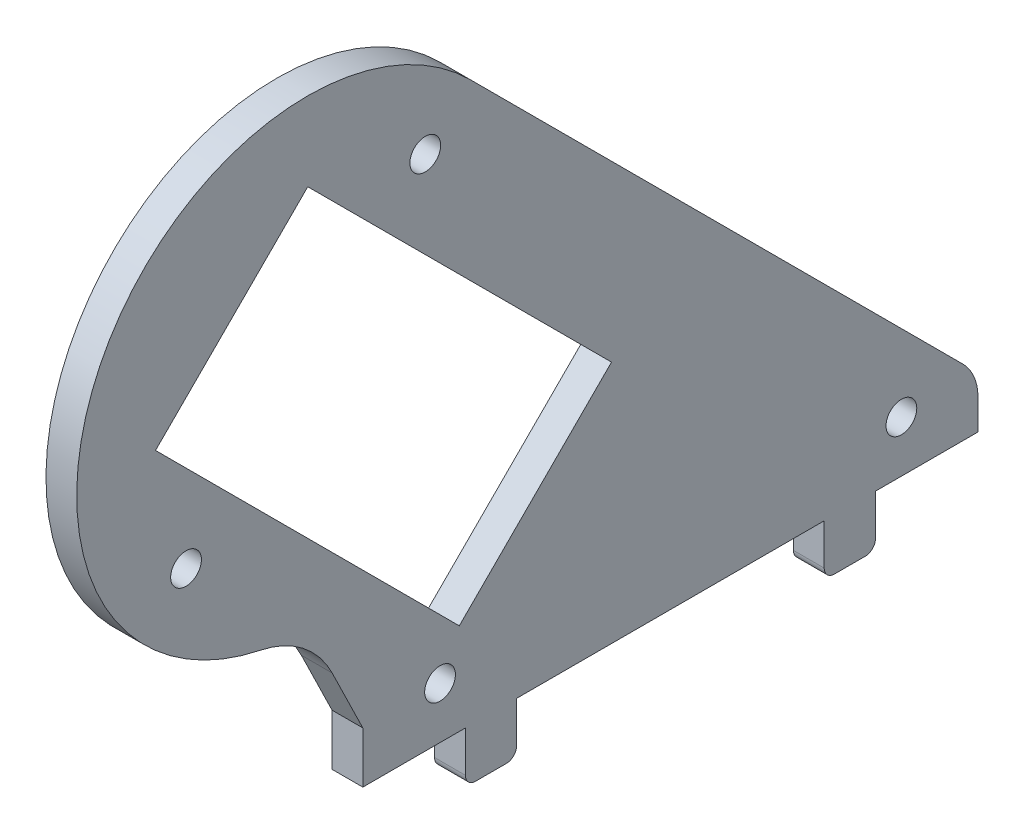
ISO-10303-21;
HEADER;
FILE_DESCRIPTION(('STEP AP214'),'2;1');
FILE_NAME('part.step','',(''),(''),'','','');
FILE_SCHEMA(('AUTOMOTIVE_DESIGN { 1 0 10303 214 1 1 1 1 }'));
ENDSEC;
DATA;
#1=APPLICATION_CONTEXT('core data for automotive mechanical design processes');
#2=APPLICATION_PROTOCOL_DEFINITION('international standard','automotive_design',2000,#1);
#3=PRODUCT_CONTEXT('',#1,'mechanical');
#4=PRODUCT('Part','Part','',(#3));
#5=PRODUCT_RELATED_PRODUCT_CATEGORY('part','',(#4));
#6=PRODUCT_DEFINITION_FORMATION('','',#4);
#7=PRODUCT_DEFINITION_CONTEXT('part definition',#1,'design');
#8=PRODUCT_DEFINITION('design','',#6,#7);
#9=PRODUCT_DEFINITION_SHAPE('','',#8);
#10=(LENGTH_UNIT() NAMED_UNIT(*) SI_UNIT(.MILLI.,.METRE.));
#11=(NAMED_UNIT(*) PLANE_ANGLE_UNIT() SI_UNIT($,.RADIAN.));
#12=(NAMED_UNIT(*) SI_UNIT($,.STERADIAN.) SOLID_ANGLE_UNIT());
#13=UNCERTAINTY_MEASURE_WITH_UNIT(LENGTH_MEASURE(1.E-05),#10,'distance_accuracy_value','');
#14=(GEOMETRIC_REPRESENTATION_CONTEXT(3) GLOBAL_UNCERTAINTY_ASSIGNED_CONTEXT((#13)) GLOBAL_UNIT_ASSIGNED_CONTEXT((#10,
#11,#12)) REPRESENTATION_CONTEXT('',''));
#15=CARTESIAN_POINT('',(0.,0.,0.));
#16=DIRECTION('',(0.,0.,1.));
#17=DIRECTION('',(1.,0.,0.));
#18=AXIS2_PLACEMENT_3D('',#15,#16,#17);
#19=CARTESIAN_POINT('',(3.,0.,0.));
#20=DIRECTION('',(1.,0.,0.));
#21=DIRECTION('',(0.,0.,-1.));
#22=AXIS2_PLACEMENT_3D('',#19,#20,#21);
#23=PLANE('',#22);
#24=CARTESIAN_POINT('',(3.,7.5,-22.5287166150444));
#25=DIRECTION('',(1.,0.,0.));
#26=DIRECTION('',(0.,0.,-1.));
#27=AXIS2_PLACEMENT_3D('',#24,#25,#26);
#28=CIRCLE('',#27,1.5);
#29=CARTESIAN_POINT('',(3.,7.5,-24.0287166150444));
#30=VERTEX_POINT('',#29);
#31=EDGE_CURVE('E729',#30,#30,#28,.T.);
#32=ORIENTED_EDGE('',*,*,#31,.F.);
#33=EDGE_LOOP('',(#32));
#34=FACE_BOUND('',#33,.T.);
#35=CARTESIAN_POINT('',(3.,52.9250962228143,23.9103775970528));
#36=DIRECTION('',(1.,0.,0.));
#37=DIRECTION('',(0.,0.,-1.));
#38=AXIS2_PLACEMENT_3D('',#35,#36,#37);
#39=CIRCLE('',#38,1.5);
#40=CARTESIAN_POINT('',(3.,52.9250962228143,22.4103775970528));
#41=VERTEX_POINT('',#40);
#42=EDGE_CURVE('E737',#41,#41,#39,.T.);
#43=ORIENTED_EDGE('',*,*,#42,.F.);
#44=EDGE_LOOP('',(#43));
#45=FACE_BOUND('',#44,.T.);
#46=CARTESIAN_POINT('',(3.,29.5905724436583,47.2449013762088));
#47=DIRECTION('',(1.,0.,0.));
#48=DIRECTION('',(0.,0.,-1.));
#49=AXIS2_PLACEMENT_3D('',#46,#47,#48);
#50=CIRCLE('',#49,1.5);
#51=CARTESIAN_POINT('',(3.,29.5905724436583,45.7449013762088));
#52=VERTEX_POINT('',#51);
#53=EDGE_CURVE('E733',#52,#52,#50,.T.);
#54=ORIENTED_EDGE('',*,*,#53,.F.);
#55=EDGE_LOOP('',(#54));
#56=FACE_BOUND('',#55,.T.);
#57=CARTESIAN_POINT('',(3.,7.5,22.4712833849556));
#58=DIRECTION('',(1.,0.,0.));
#59=DIRECTION('',(0.,0.,-1.));
#60=AXIS2_PLACEMENT_3D('',#57,#58,#59);
#61=CIRCLE('',#60,1.5);
#62=CARTESIAN_POINT('',(3.,7.5,20.9712833849556));
#63=VERTEX_POINT('',#62);
#64=EDGE_CURVE('E751',#63,#63,#61,.T.);
#65=ORIENTED_EDGE('',*,*,#64,.F.);
#66=EDGE_LOOP('',(#65));
#67=FACE_BOUND('',#66,.T.);
#68=DIRECTION('',(0.,-1.,0.));
#69=VECTOR('',#68,1.);
#70=CARTESIAN_POINT('',(3.,0.,-30.));
#71=LINE('',#70,#69);
#72=CARTESIAN_POINT('',(3.,5.42893218813453,-30.));
#73=VERTEX_POINT('',#72);
#74=CARTESIAN_POINT('',(3.,2.5,-30.));
#75=VERTEX_POINT('',#74);
#76=EDGE_CURVE('E275',#73,#75,#71,.T.);
#77=ORIENTED_EDGE('',*,*,#76,.F.);
#78=CARTESIAN_POINT('',(3.,5.42893218813453,-25.));
#79=DIRECTION('',(1.,0.,0.));
#80=DIRECTION('',(0.,0.,-1.));
#81=AXIS2_PLACEMENT_3D('',#78,#79,#80);
#82=CIRCLE('',#81,5.);
#83=CARTESIAN_POINT('',(3.,8.96446609406726,-28.5355339059327));
#84=VERTEX_POINT('',#83);
#85=EDGE_CURVE('E11',#73,#84,#82,.T.);
#86=ORIENTED_EDGE('',*,*,#85,.T.);
#87=DIRECTION('',(0.,0.707106781186549,0.707106781186546));
#88=VECTOR('',#87,1.);
#89=CARTESIAN_POINT('',(3.,18.75,-18.75));
#90=LINE('',#89,#88);
#91=CARTESIAN_POINT('',(3.,56.9974746830584,19.4974746830582));
#92=VERTEX_POINT('',#91);
#93=EDGE_CURVE('E240',#84,#92,#90,.T.);
#94=ORIENTED_EDGE('',*,*,#93,.T.);
#95=CARTESIAN_POINT('',(3.,41.0875721063611,35.4073772597556));
#96=DIRECTION('',(1.,0.,0.));
#97=DIRECTION('',(0.,0.,-1.));
#98=AXIS2_PLACEMENT_3D('',#95,#96,#97);
#99=CIRCLE('',#98,22.5);
#100=CARTESIAN_POINT('',(3.,19.0530880834944,39.9605644781809));
#101=VERTEX_POINT('',#100);
#102=EDGE_CURVE('E242',#92,#101,#99,.T.);
#103=ORIENTED_EDGE('',*,*,#102,.T.);
#104=CARTESIAN_POINT('',(3.,9.2599840733314,41.9842032419254));
#105=DIRECTION('',(1.,0.,0.));
#106=DIRECTION('',(0.,0.,-1.));
#107=AXIS2_PLACEMENT_3D('',#104,#105,#106);
#108=CIRCLE('',#107,10.);
#109=CARTESIAN_POINT('',(3.,13.6434381885261,32.9961372641979));
#110=VERTEX_POINT('',#109);
#111=EDGE_CURVE('E340',#101,#110,#108,.F.);
#112=ORIENTED_EDGE('',*,*,#111,.T.);
#113=DIRECTION('',(0.,-0.89880659777275,-0.43834541151947));
#114=VECTOR('',#113,1.);
#115=CARTESIAN_POINT('',(3.,-10.378532190812,21.2806908961665));
#116=LINE('',#115,#114);
#117=CARTESIAN_POINT('',(3.,7.5,30.));
#118=VERTEX_POINT('',#117);
#119=EDGE_CURVE('E246',#110,#118,#116,.T.);
#120=ORIENTED_EDGE('',*,*,#119,.T.);
#121=DIRECTION('',(0.,-1.,0.));
#122=VECTOR('',#121,1.);
#123=CARTESIAN_POINT('',(3.,0.,30.));
#124=LINE('',#123,#122);
#125=CARTESIAN_POINT('',(3.,2.5,30.));
#126=VERTEX_POINT('',#125);
#127=EDGE_CURVE('E248',#118,#126,#124,.T.);
#128=ORIENTED_EDGE('',*,*,#127,.T.);
#129=DIRECTION('',(0.,0.,1.));
#130=VECTOR('',#129,1.);
#131=CARTESIAN_POINT('',(3.,2.5,0.));
#132=LINE('',#131,#130);
#133=CARTESIAN_POINT('',(3.,2.5,20.));
#134=VERTEX_POINT('',#133);
#135=EDGE_CURVE('E250',#134,#126,#132,.T.);
#136=ORIENTED_EDGE('',*,*,#135,.F.);
#137=DIRECTION('',(0.,1.,0.));
#138=VECTOR('',#137,1.);
#139=CARTESIAN_POINT('',(3.,0.,20.));
#140=LINE('',#139,#138);
#141=CARTESIAN_POINT('',(3.,-1.5,20.));
#142=VERTEX_POINT('',#141);
#143=EDGE_CURVE('E253',#142,#134,#140,.T.);
#144=ORIENTED_EDGE('',*,*,#143,.F.);
#145=CARTESIAN_POINT('',(3.,-1.5,19.));
#146=DIRECTION('',(1.,0.,0.));
#147=DIRECTION('',(0.,0.,-1.));
#148=AXIS2_PLACEMENT_3D('',#145,#146,#147);
#149=CIRCLE('',#148,1.);
#150=CARTESIAN_POINT('',(3.,-2.5,19.));
#151=VERTEX_POINT('',#150);
#152=EDGE_CURVE('E363',#142,#151,#149,.T.);
#153=ORIENTED_EDGE('',*,*,#152,.T.);
#154=DIRECTION('',(0.,0.,1.));
#155=VECTOR('',#154,1.);
#156=CARTESIAN_POINT('',(3.,-2.5,0.));
#157=LINE('',#156,#155);
#158=CARTESIAN_POINT('',(3.,-2.5,16.));
#159=VERTEX_POINT('',#158);
#160=EDGE_CURVE('E255',#159,#151,#157,.T.);
#161=ORIENTED_EDGE('',*,*,#160,.F.);
#162=CARTESIAN_POINT('',(3.,-1.5,16.));
#163=DIRECTION('',(1.,0.,0.));
#164=DIRECTION('',(0.,0.,-1.));
#165=AXIS2_PLACEMENT_3D('',#162,#163,#164);
#166=CIRCLE('',#165,1.);
#167=CARTESIAN_POINT('',(3.,-1.5,15.));
#168=VERTEX_POINT('',#167);
#169=EDGE_CURVE('E361',#159,#168,#166,.T.);
#170=ORIENTED_EDGE('',*,*,#169,.T.);
#171=DIRECTION('',(0.,-1.,0.));
#172=VECTOR('',#171,1.);
#173=CARTESIAN_POINT('',(3.,0.,15.));
#174=LINE('',#173,#172);
#175=CARTESIAN_POINT('',(3.,2.5,15.));
#176=VERTEX_POINT('',#175);
#177=EDGE_CURVE('E258',#176,#168,#174,.T.);
#178=ORIENTED_EDGE('',*,*,#177,.F.);
#179=DIRECTION('',(0.,0.,1.));
#180=VECTOR('',#179,1.);
#181=CARTESIAN_POINT('',(3.,2.49999999999999,0.));
#182=LINE('',#181,#180);
#183=CARTESIAN_POINT('',(3.,2.49999999999998,-15.));
#184=VERTEX_POINT('',#183);
#185=EDGE_CURVE('E261',#184,#176,#182,.T.);
#186=ORIENTED_EDGE('',*,*,#185,.F.);
#187=DIRECTION('',(0.,-1.,0.));
#188=VECTOR('',#187,1.);
#189=CARTESIAN_POINT('',(3.,0.,-15.));
#190=LINE('',#189,#188);
#191=CARTESIAN_POINT('',(3.,-1.5,-15.));
#192=VERTEX_POINT('',#191);
#193=EDGE_CURVE('E264',#184,#192,#190,.T.);
#194=ORIENTED_EDGE('',*,*,#193,.T.);
#195=CARTESIAN_POINT('',(3.,-1.5,-16.));
#196=DIRECTION('',(1.,0.,0.));
#197=DIRECTION('',(0.,0.,-1.));
#198=AXIS2_PLACEMENT_3D('',#195,#196,#197);
#199=CIRCLE('',#198,1.);
#200=CARTESIAN_POINT('',(3.,-2.5,-16.));
#201=VERTEX_POINT('',#200);
#202=EDGE_CURVE('E359',#192,#201,#199,.T.);
#203=ORIENTED_EDGE('',*,*,#202,.T.);
#204=DIRECTION('',(0.,0.,1.));
#205=VECTOR('',#204,1.);
#206=CARTESIAN_POINT('',(3.,-2.5,0.));
#207=LINE('',#206,#205);
#208=CARTESIAN_POINT('',(3.,-2.5,-19.));
#209=VERTEX_POINT('',#208);
#210=EDGE_CURVE('E267',#209,#201,#207,.T.);
#211=ORIENTED_EDGE('',*,*,#210,.F.);
#212=CARTESIAN_POINT('',(3.,-1.5,-19.));
#213=DIRECTION('',(1.,0.,0.));
#214=DIRECTION('',(0.,0.,-1.));
#215=AXIS2_PLACEMENT_3D('',#212,#213,#214);
#216=CIRCLE('',#215,1.);
#217=CARTESIAN_POINT('',(3.,-1.5,-20.));
#218=VERTEX_POINT('',#217);
#219=EDGE_CURVE('E357',#209,#218,#216,.T.);
#220=ORIENTED_EDGE('',*,*,#219,.T.);
#221=DIRECTION('',(0.,1.,0.));
#222=VECTOR('',#221,1.);
#223=CARTESIAN_POINT('',(3.,0.,-20.));
#224=LINE('',#223,#222);
#225=CARTESIAN_POINT('',(3.,2.5,-20.));
#226=VERTEX_POINT('',#225);
#227=EDGE_CURVE('E270',#218,#226,#224,.T.);
#228=ORIENTED_EDGE('',*,*,#227,.T.);
#229=DIRECTION('',(0.,0.,1.));
#230=VECTOR('',#229,1.);
#231=CARTESIAN_POINT('',(3.,2.5,0.));
#232=LINE('',#231,#230);
#233=EDGE_CURVE('E272',#75,#226,#232,.T.);
#234=ORIENTED_EDGE('',*,*,#233,.F.);
#235=EDGE_LOOP('',(#77,#86,#94,#103,#112,#120,#128,#136,#144,#153,#161,#170,#178,#186,#194,#203,
#211,#220,#228,#234));
#236=FACE_BOUND('',#235,.T.);
#237=DIRECTION('',(0.,0.707106781186547,0.707106781186548));
#238=VECTOR('',#237,1.);
#239=CARTESIAN_POINT('',(3.,-4.58452377915599,4.58452377915599));
#240=LINE('',#239,#238);
#241=CARTESIAN_POINT('',(3.,11.4244426355855,20.5934901938974));
#242=VERTEX_POINT('',#241);
#243=CARTESIAN_POINT('',(3.,41.0522167673018,50.2212643256138));
#244=VERTEX_POINT('',#243);
#245=EDGE_CURVE('E233',#242,#244,#240,.T.);
#246=ORIENTED_EDGE('',*,*,#245,.T.);
#247=DIRECTION('',(0.,0.707106781186548,-0.707106781186548));
#248=VECTOR('',#247,1.);
#249=CARTESIAN_POINT('',(3.,45.6367405464578,45.6367405464578));
#250=LINE('',#249,#248);
#251=CARTESIAN_POINT('',(3.,55.9014591722193,35.3720219206963));
#252=VERTEX_POINT('',#251);
#253=EDGE_CURVE('E236',#244,#252,#250,.T.);
#254=ORIENTED_EDGE('',*,*,#253,.T.);
#255=DIRECTION('',(0.,-0.707106781186548,-0.707106781186548));
#256=VECTOR('',#255,1.);
#257=CARTESIAN_POINT('',(3.,10.2647186257615,-10.2647186257615));
#258=LINE('',#257,#256);
#259=CARTESIAN_POINT('',(3.,26.2736850405029,5.74424778897995));
#260=VERTEX_POINT('',#259);
#261=EDGE_CURVE('E228',#252,#260,#258,.T.);
#262=ORIENTED_EDGE('',*,*,#261,.T.);
#263=DIRECTION('',(0.,0.707106781186547,-0.707106781186548));
#264=VECTOR('',#263,1.);
#265=CARTESIAN_POINT('',(3.,16.0089664147415,16.0089664147414));
#266=LINE('',#265,#264);
#267=EDGE_CURVE('E204',#242,#260,#266,.T.);
#268=ORIENTED_EDGE('',*,*,#267,.F.);
#269=EDGE_LOOP('',(#246,#254,#262,#268));
#270=FACE_BOUND('',#269,.T.);
#271=ADVANCED_FACE('F37',(#34,#45,#56,#67,#236,#270),#23,.T.);
#272=CARTESIAN_POINT('',(0.,0.,0.));
#273=DIRECTION('',(1.,0.,0.));
#274=DIRECTION('',(0.,0.,-1.));
#275=AXIS2_PLACEMENT_3D('',#272,#273,#274);
#276=PLANE('',#275);
#277=CARTESIAN_POINT('',(0.,7.5,-22.5287166150444));
#278=DIRECTION('',(-1.,0.,0.));
#279=DIRECTION('',(0.,0.,1.));
#280=AXIS2_PLACEMENT_3D('',#277,#278,#279);
#281=CIRCLE('',#280,1.5);
#282=CARTESIAN_POINT('',(0.,7.5,-21.0287166150444));
#283=VERTEX_POINT('',#282);
#284=EDGE_CURVE('E732',#283,#283,#281,.T.);
#285=ORIENTED_EDGE('',*,*,#284,.F.);
#286=EDGE_LOOP('',(#285));
#287=FACE_BOUND('',#286,.T.);
#288=CARTESIAN_POINT('',(0.,52.9250962228143,23.9103775970528));
#289=DIRECTION('',(-1.,0.,0.));
#290=DIRECTION('',(0.,0.,1.));
#291=AXIS2_PLACEMENT_3D('',#288,#289,#290);
#292=CIRCLE('',#291,1.5);
#293=CARTESIAN_POINT('',(0.,52.9250962228143,25.4103775970528));
#294=VERTEX_POINT('',#293);
#295=EDGE_CURVE('E734',#294,#294,#292,.T.);
#296=ORIENTED_EDGE('',*,*,#295,.F.);
#297=EDGE_LOOP('',(#296));
#298=FACE_BOUND('',#297,.T.);
#299=CARTESIAN_POINT('',(0.,29.5905724436583,47.2449013762088));
#300=DIRECTION('',(-1.,0.,0.));
#301=DIRECTION('',(0.,0.,1.));
#302=AXIS2_PLACEMENT_3D('',#299,#300,#301);
#303=CIRCLE('',#302,1.5);
#304=CARTESIAN_POINT('',(0.,29.5905724436583,48.7449013762088));
#305=VERTEX_POINT('',#304);
#306=EDGE_CURVE('E740',#305,#305,#303,.T.);
#307=ORIENTED_EDGE('',*,*,#306,.F.);
#308=EDGE_LOOP('',(#307));
#309=FACE_BOUND('',#308,.T.);
#310=CARTESIAN_POINT('',(0.,7.5,22.4712833849556));
#311=DIRECTION('',(-1.,0.,0.));
#312=DIRECTION('',(0.,0.,1.));
#313=AXIS2_PLACEMENT_3D('',#310,#311,#312);
#314=CIRCLE('',#313,1.5);
#315=CARTESIAN_POINT('',(0.,7.5,23.9712833849556));
#316=VERTEX_POINT('',#315);
#317=EDGE_CURVE('E748',#316,#316,#314,.T.);
#318=ORIENTED_EDGE('',*,*,#317,.F.);
#319=EDGE_LOOP('',(#318));
#320=FACE_BOUND('',#319,.T.);
#321=DIRECTION('',(0.,0.707106781186549,0.707106781186546));
#322=VECTOR('',#321,1.);
#323=CARTESIAN_POINT('',(0.,18.75,-18.75));
#324=LINE('',#323,#322);
#325=CARTESIAN_POINT('',(0.,8.96446609406726,-28.5355339059327));
#326=VERTEX_POINT('',#325);
#327=CARTESIAN_POINT('',(0.,56.9974746830584,19.4974746830582));
#328=VERTEX_POINT('',#327);
#329=EDGE_CURVE('E239',#326,#328,#324,.T.);
#330=ORIENTED_EDGE('',*,*,#329,.F.);
#331=CARTESIAN_POINT('',(0.,5.42893218813453,-25.));
#332=DIRECTION('',(1.,0.,0.));
#333=DIRECTION('',(0.,0.,-1.));
#334=AXIS2_PLACEMENT_3D('',#331,#332,#333);
#335=CIRCLE('',#334,5.);
#336=CARTESIAN_POINT('',(0.,5.42893218813453,-30.));
#337=VERTEX_POINT('',#336);
#338=EDGE_CURVE('E59',#326,#337,#335,.F.);
#339=ORIENTED_EDGE('',*,*,#338,.T.);
#340=DIRECTION('',(0.,-1.,0.));
#341=VECTOR('',#340,1.);
#342=CARTESIAN_POINT('',(0.,0.,-30.));
#343=LINE('',#342,#341);
#344=CARTESIAN_POINT('',(0.,2.5,-30.));
#345=VERTEX_POINT('',#344);
#346=EDGE_CURVE('E243',#337,#345,#343,.T.);
#347=ORIENTED_EDGE('',*,*,#346,.T.);
#348=DIRECTION('',(0.,0.,1.));
#349=VECTOR('',#348,1.);
#350=CARTESIAN_POINT('',(0.,2.5,0.));
#351=LINE('',#350,#349);
#352=CARTESIAN_POINT('',(0.,2.5,-20.));
#353=VERTEX_POINT('',#352);
#354=EDGE_CURVE('E309',#345,#353,#351,.T.);
#355=ORIENTED_EDGE('',*,*,#354,.T.);
#356=DIRECTION('',(0.,1.,0.));
#357=VECTOR('',#356,1.);
#358=CARTESIAN_POINT('',(0.,0.,-20.));
#359=LINE('',#358,#357);
#360=CARTESIAN_POINT('',(0.,-1.5,-20.));
#361=VERTEX_POINT('',#360);
#362=EDGE_CURVE('E307',#361,#353,#359,.T.);
#363=ORIENTED_EDGE('',*,*,#362,.F.);
#364=CARTESIAN_POINT('',(0.,-1.5,-19.));
#365=DIRECTION('',(1.,0.,0.));
#366=DIRECTION('',(0.,0.,-1.));
#367=AXIS2_PLACEMENT_3D('',#364,#365,#366);
#368=CIRCLE('',#367,1.);
#369=CARTESIAN_POINT('',(0.,-2.5,-19.));
#370=VERTEX_POINT('',#369);
#371=EDGE_CURVE('E347',#361,#370,#368,.F.);
#372=ORIENTED_EDGE('',*,*,#371,.T.);
#373=DIRECTION('',(0.,0.,1.));
#374=VECTOR('',#373,1.);
#375=CARTESIAN_POINT('',(0.,-2.5,0.));
#376=LINE('',#375,#374);
#377=CARTESIAN_POINT('',(0.,-2.5,-16.));
#378=VERTEX_POINT('',#377);
#379=EDGE_CURVE('E304',#370,#378,#376,.T.);
#380=ORIENTED_EDGE('',*,*,#379,.T.);
#381=CARTESIAN_POINT('',(0.,-1.5,-16.));
#382=DIRECTION('',(1.,0.,0.));
#383=DIRECTION('',(0.,0.,-1.));
#384=AXIS2_PLACEMENT_3D('',#381,#382,#383);
#385=CIRCLE('',#384,1.);
#386=CARTESIAN_POINT('',(0.,-1.5,-15.));
#387=VERTEX_POINT('',#386);
#388=EDGE_CURVE('E349',#378,#387,#385,.F.);
#389=ORIENTED_EDGE('',*,*,#388,.T.);
#390=DIRECTION('',(0.,-1.,0.));
#391=VECTOR('',#390,1.);
#392=CARTESIAN_POINT('',(0.,0.,-15.));
#393=LINE('',#392,#391);
#394=CARTESIAN_POINT('',(0.,2.49999999999998,-15.));
#395=VERTEX_POINT('',#394);
#396=EDGE_CURVE('E301',#395,#387,#393,.T.);
#397=ORIENTED_EDGE('',*,*,#396,.F.);
#398=DIRECTION('',(0.,0.,1.));
#399=VECTOR('',#398,1.);
#400=CARTESIAN_POINT('',(0.,2.49999999999999,0.));
#401=LINE('',#400,#399);
#402=CARTESIAN_POINT('',(0.,2.5,15.));
#403=VERTEX_POINT('',#402);
#404=EDGE_CURVE('E298',#395,#403,#401,.T.);
#405=ORIENTED_EDGE('',*,*,#404,.T.);
#406=DIRECTION('',(0.,-1.,0.));
#407=VECTOR('',#406,1.);
#408=CARTESIAN_POINT('',(0.,0.,15.));
#409=LINE('',#408,#407);
#410=CARTESIAN_POINT('',(0.,-1.5,15.));
#411=VERTEX_POINT('',#410);
#412=EDGE_CURVE('E295',#403,#411,#409,.T.);
#413=ORIENTED_EDGE('',*,*,#412,.T.);
#414=CARTESIAN_POINT('',(0.,-1.5,16.));
#415=DIRECTION('',(1.,0.,0.));
#416=DIRECTION('',(0.,0.,-1.));
#417=AXIS2_PLACEMENT_3D('',#414,#415,#416);
#418=CIRCLE('',#417,1.);
#419=CARTESIAN_POINT('',(0.,-2.5,16.));
#420=VERTEX_POINT('',#419);
#421=EDGE_CURVE('E351',#411,#420,#418,.F.);
#422=ORIENTED_EDGE('',*,*,#421,.T.);
#423=DIRECTION('',(0.,0.,1.));
#424=VECTOR('',#423,1.);
#425=CARTESIAN_POINT('',(0.,-2.5,0.));
#426=LINE('',#425,#424);
#427=CARTESIAN_POINT('',(0.,-2.5,19.));
#428=VERTEX_POINT('',#427);
#429=EDGE_CURVE('E292',#420,#428,#426,.T.);
#430=ORIENTED_EDGE('',*,*,#429,.T.);
#431=CARTESIAN_POINT('',(0.,-1.5,19.));
#432=DIRECTION('',(1.,0.,0.));
#433=DIRECTION('',(0.,0.,-1.));
#434=AXIS2_PLACEMENT_3D('',#431,#432,#433);
#435=CIRCLE('',#434,1.);
#436=CARTESIAN_POINT('',(0.,-1.5,20.));
#437=VERTEX_POINT('',#436);
#438=EDGE_CURVE('E353',#428,#437,#435,.F.);
#439=ORIENTED_EDGE('',*,*,#438,.T.);
#440=DIRECTION('',(0.,1.,0.));
#441=VECTOR('',#440,1.);
#442=CARTESIAN_POINT('',(0.,0.,20.));
#443=LINE('',#442,#441);
#444=CARTESIAN_POINT('',(0.,2.5,20.));
#445=VERTEX_POINT('',#444);
#446=EDGE_CURVE('E290',#437,#445,#443,.T.);
#447=ORIENTED_EDGE('',*,*,#446,.T.);
#448=DIRECTION('',(0.,0.,1.));
#449=VECTOR('',#448,1.);
#450=CARTESIAN_POINT('',(0.,2.5,0.));
#451=LINE('',#450,#449);
#452=CARTESIAN_POINT('',(0.,2.5,30.));
#453=VERTEX_POINT('',#452);
#454=EDGE_CURVE('E287',#445,#453,#451,.T.);
#455=ORIENTED_EDGE('',*,*,#454,.T.);
#456=DIRECTION('',(0.,-1.,0.));
#457=VECTOR('',#456,1.);
#458=CARTESIAN_POINT('',(0.,0.,30.));
#459=LINE('',#458,#457);
#460=CARTESIAN_POINT('',(0.,7.5,30.));
#461=VERTEX_POINT('',#460);
#462=EDGE_CURVE('E284',#461,#453,#459,.T.);
#463=ORIENTED_EDGE('',*,*,#462,.F.);
#464=DIRECTION('',(0.,-0.89880659777275,-0.43834541151947));
#465=VECTOR('',#464,1.);
#466=CARTESIAN_POINT('',(0.,-10.378532190812,21.2806908961665));
#467=LINE('',#466,#465);
#468=CARTESIAN_POINT('',(0.,13.6434381885261,32.9961372641979));
#469=VERTEX_POINT('',#468);
#470=EDGE_CURVE('E282',#469,#461,#467,.T.);
#471=ORIENTED_EDGE('',*,*,#470,.F.);
#472=CARTESIAN_POINT('',(0.,9.2599840733314,41.9842032419254));
#473=DIRECTION('',(1.,0.,0.));
#474=DIRECTION('',(0.,0.,-1.));
#475=AXIS2_PLACEMENT_3D('',#472,#473,#474);
#476=CIRCLE('',#475,10.);
#477=CARTESIAN_POINT('',(0.,19.0530880834944,39.9605644781809));
#478=VERTEX_POINT('',#477);
#479=EDGE_CURVE('E338',#469,#478,#476,.T.);
#480=ORIENTED_EDGE('',*,*,#479,.T.);
#481=CARTESIAN_POINT('',(0.,41.0875721063611,35.4073772597556));
#482=DIRECTION('',(1.,0.,0.));
#483=DIRECTION('',(0.,0.,-1.));
#484=AXIS2_PLACEMENT_3D('',#481,#482,#483);
#485=CIRCLE('',#484,22.5);
#486=EDGE_CURVE('E279',#328,#478,#485,.T.);
#487=ORIENTED_EDGE('',*,*,#486,.F.);
#488=EDGE_LOOP('',(#330,#339,#347,#355,#363,#372,#380,#389,#397,#405,#413,#422,#430,#439,#447,
#455,#463,#471,#480,#487));
#489=FACE_BOUND('',#488,.T.);
#490=DIRECTION('',(0.,-0.707106781186548,0.707106781186548));
#491=VECTOR('',#490,1.);
#492=CARTESIAN_POINT('',(0.,45.6367405464578,45.6367405464578));
#493=LINE('',#492,#491);
#494=CARTESIAN_POINT('',(0.,55.9014591722193,35.3720219206963));
#495=VERTEX_POINT('',#494);
#496=CARTESIAN_POINT('',(0.,41.0522167673018,50.2212643256138));
#497=VERTEX_POINT('',#496);
#498=EDGE_CURVE('E217',#495,#497,#493,.T.);
#499=ORIENTED_EDGE('',*,*,#498,.T.);
#500=DIRECTION('',(0.,-0.707106781186547,-0.707106781186548));
#501=VECTOR('',#500,1.);
#502=CARTESIAN_POINT('',(0.,-4.58452377915599,4.58452377915599));
#503=LINE('',#502,#501);
#504=CARTESIAN_POINT('',(0.,11.4244426355855,20.5934901938974));
#505=VERTEX_POINT('',#504);
#506=EDGE_CURVE('E221',#497,#505,#503,.T.);
#507=ORIENTED_EDGE('',*,*,#506,.T.);
#508=DIRECTION('',(0.,-0.707106781186547,0.707106781186548));
#509=VECTOR('',#508,1.);
#510=CARTESIAN_POINT('',(0.,16.0089664147415,16.0089664147414));
#511=LINE('',#510,#509);
#512=CARTESIAN_POINT('',(0.,26.2736850405029,5.74424778897995));
#513=VERTEX_POINT('',#512);
#514=EDGE_CURVE('E201',#513,#505,#511,.T.);
#515=ORIENTED_EDGE('',*,*,#514,.F.);
#516=DIRECTION('',(0.,0.707106781186548,0.707106781186548));
#517=VECTOR('',#516,1.);
#518=CARTESIAN_POINT('',(0.,10.2647186257615,-10.2647186257615));
#519=LINE('',#518,#517);
#520=EDGE_CURVE('E212',#513,#495,#519,.T.);
#521=ORIENTED_EDGE('',*,*,#520,.T.);
#522=EDGE_LOOP('',(#499,#507,#515,#521));
#523=FACE_BOUND('',#522,.T.);
#524=ADVANCED_FACE('F219',(#287,#298,#309,#320,#489,#523),#276,.F.);
#525=CARTESIAN_POINT('',(3.,18.75,-18.75));
#526=DIRECTION('',(0.,-0.707106781186546,0.707106781186548));
#527=DIRECTION('',(0.,-0.707106781186549,-0.707106781186546));
#528=AXIS2_PLACEMENT_3D('',#525,#526,#527);
#529=PLANE('',#528);
#530=ORIENTED_EDGE('',*,*,#93,.F.);
#531=DIRECTION('',(-1.,0.,0.));
#532=VECTOR('',#531,1.);
#533=CARTESIAN_POINT('',(0.,8.96446609406726,-28.5355339059327));
#534=LINE('',#533,#532);
#535=EDGE_CURVE('E378',#84,#326,#534,.T.);
#536=ORIENTED_EDGE('',*,*,#535,.T.);
#537=ORIENTED_EDGE('',*,*,#329,.T.);
#538=DIRECTION('',(-1.,0.,0.));
#539=VECTOR('',#538,1.);
#540=CARTESIAN_POINT('',(3.,56.9974746830584,19.4974746830582));
#541=LINE('',#540,#539);
#542=EDGE_CURVE('E330',#92,#328,#541,.T.);
#543=ORIENTED_EDGE('',*,*,#542,.F.);
#544=EDGE_LOOP('',(#530,#536,#537,#543));
#545=FACE_BOUND('',#544,.T.);
#546=ADVANCED_FACE('F384',(#545),#529,.F.);
#547=CARTESIAN_POINT('',(3.,41.0875721063611,35.4073772597556));
#548=DIRECTION('',(-1.,0.,0.));
#549=DIRECTION('',(0.,0.,1.));
#550=AXIS2_PLACEMENT_3D('',#547,#548,#549);
#551=CYLINDRICAL_SURFACE('',#550,22.5);
#552=ORIENTED_EDGE('',*,*,#486,.T.);
#553=DIRECTION('',(-1.,0.,0.));
#554=VECTOR('',#553,1.);
#555=CARTESIAN_POINT('',(3.,19.0530880834944,39.9605644781809));
#556=LINE('',#555,#554);
#557=EDGE_CURVE('E336',#478,#101,#556,.F.);
#558=ORIENTED_EDGE('',*,*,#557,.T.);
#559=ORIENTED_EDGE('',*,*,#102,.F.);
#560=ORIENTED_EDGE('',*,*,#542,.T.);
#561=EDGE_LOOP('',(#552,#558,#559,#560));
#562=FACE_BOUND('',#561,.T.);
#563=ADVANCED_FACE('F393',(#562),#551,.T.);
#564=CARTESIAN_POINT('',(3.,-10.378532190812,21.2806908961665));
#565=DIRECTION('',(0.,0.43834541151947,-0.898806597772751));
#566=DIRECTION('',(0.,0.898806597772751,0.43834541151947));
#567=AXIS2_PLACEMENT_3D('',#564,#565,#566);
#568=PLANE('',#567);
#569=ORIENTED_EDGE('',*,*,#119,.F.);
#570=DIRECTION('',(1.,0.,0.));
#571=VECTOR('',#570,1.);
#572=CARTESIAN_POINT('',(0.,13.6434381885261,32.9961372641979));
#573=LINE('',#572,#571);
#574=EDGE_CURVE('E333',#110,#469,#573,.F.);
#575=ORIENTED_EDGE('',*,*,#574,.T.);
#576=ORIENTED_EDGE('',*,*,#470,.T.);
#577=DIRECTION('',(-1.,0.,0.));
#578=VECTOR('',#577,1.);
#579=CARTESIAN_POINT('',(3.,7.5,30.));
#580=LINE('',#579,#578);
#581=EDGE_CURVE('E327',#118,#461,#580,.T.);
#582=ORIENTED_EDGE('',*,*,#581,.F.);
#583=EDGE_LOOP('',(#569,#575,#576,#582));
#584=FACE_BOUND('',#583,.T.);
#585=ADVANCED_FACE('F402',(#584),#568,.F.);
#586=CARTESIAN_POINT('',(3.,0.,30.));
#587=DIRECTION('',(0.,0.,-1.));
#588=DIRECTION('',(0.,1.,0.));
#589=AXIS2_PLACEMENT_3D('',#586,#587,#588);
#590=PLANE('',#589);
#591=ORIENTED_EDGE('',*,*,#462,.T.);
#592=DIRECTION('',(-1.,0.,0.));
#593=VECTOR('',#592,1.);
#594=CARTESIAN_POINT('',(3.,2.5,30.));
#595=LINE('',#594,#593);
#596=EDGE_CURVE('E325',#126,#453,#595,.T.);
#597=ORIENTED_EDGE('',*,*,#596,.F.);
#598=ORIENTED_EDGE('',*,*,#127,.F.);
#599=ORIENTED_EDGE('',*,*,#581,.T.);
#600=EDGE_LOOP('',(#591,#597,#598,#599));
#601=FACE_BOUND('',#600,.T.);
#602=ADVANCED_FACE('F408',(#601),#590,.F.);
#603=CARTESIAN_POINT('',(3.,2.5,0.));
#604=DIRECTION('',(0.,-1.,0.));
#605=DIRECTION('',(0.,0.,-1.));
#606=AXIS2_PLACEMENT_3D('',#603,#604,#605);
#607=PLANE('',#606);
#608=ORIENTED_EDGE('',*,*,#454,.F.);
#609=DIRECTION('',(-1.,0.,0.));
#610=VECTOR('',#609,1.);
#611=CARTESIAN_POINT('',(3.,2.5,20.));
#612=LINE('',#611,#610);
#613=EDGE_CURVE('E322',#134,#445,#612,.T.);
#614=ORIENTED_EDGE('',*,*,#613,.F.);
#615=ORIENTED_EDGE('',*,*,#135,.T.);
#616=ORIENTED_EDGE('',*,*,#596,.T.);
#617=EDGE_LOOP('',(#608,#614,#615,#616));
#618=FACE_BOUND('',#617,.T.);
#619=ADVANCED_FACE('F415',(#618),#607,.T.);
#620=CARTESIAN_POINT('',(3.,0.,20.));
#621=DIRECTION('',(0.,0.,1.));
#622=DIRECTION('',(1.,0.,0.));
#623=AXIS2_PLACEMENT_3D('',#620,#621,#622);
#624=PLANE('',#623);
#625=ORIENTED_EDGE('',*,*,#446,.F.);
#626=DIRECTION('',(-1.,0.,0.));
#627=VECTOR('',#626,1.);
#628=CARTESIAN_POINT('',(3.,-1.5,20.));
#629=LINE('',#628,#627);
#630=EDGE_CURVE('E355',#437,#142,#629,.F.);
#631=ORIENTED_EDGE('',*,*,#630,.T.);
#632=ORIENTED_EDGE('',*,*,#143,.T.);
#633=ORIENTED_EDGE('',*,*,#613,.T.);
#634=EDGE_LOOP('',(#625,#631,#632,#633));
#635=FACE_BOUND('',#634,.T.);
#636=ADVANCED_FACE('F418',(#635),#624,.T.);
#637=CARTESIAN_POINT('',(3.,-2.5,0.));
#638=DIRECTION('',(0.,-1.,0.));
#639=DIRECTION('',(0.,0.,-1.));
#640=AXIS2_PLACEMENT_3D('',#637,#638,#639);
#641=PLANE('',#640);
#642=ORIENTED_EDGE('',*,*,#160,.T.);
#643=DIRECTION('',(-1.,0.,0.));
#644=VECTOR('',#643,1.);
#645=CARTESIAN_POINT('',(3.,-2.5,19.));
#646=LINE('',#645,#644);
#647=EDGE_CURVE('E344',#151,#428,#646,.T.);
#648=ORIENTED_EDGE('',*,*,#647,.T.);
#649=ORIENTED_EDGE('',*,*,#429,.F.);
#650=DIRECTION('',(-1.,0.,0.));
#651=VECTOR('',#650,1.);
#652=CARTESIAN_POINT('',(3.,-2.5,16.));
#653=LINE('',#652,#651);
#654=EDGE_CURVE('E342',#420,#159,#653,.F.);
#655=ORIENTED_EDGE('',*,*,#654,.T.);
#656=EDGE_LOOP('',(#642,#648,#649,#655));
#657=FACE_BOUND('',#656,.T.);
#658=ADVANCED_FACE('F426',(#657),#641,.T.);
#659=CARTESIAN_POINT('',(3.,0.,15.));
#660=DIRECTION('',(0.,0.,-1.));
#661=DIRECTION('',(-1.,0.,0.));
#662=AXIS2_PLACEMENT_3D('',#659,#660,#661);
#663=PLANE('',#662);
#664=ORIENTED_EDGE('',*,*,#177,.T.);
#665=DIRECTION('',(-1.,0.,0.));
#666=VECTOR('',#665,1.);
#667=CARTESIAN_POINT('',(3.,-1.5,15.));
#668=LINE('',#667,#666);
#669=EDGE_CURVE('E365',#168,#411,#668,.T.);
#670=ORIENTED_EDGE('',*,*,#669,.T.);
#671=ORIENTED_EDGE('',*,*,#412,.F.);
#672=DIRECTION('',(-1.,0.,0.));
#673=VECTOR('',#672,1.);
#674=CARTESIAN_POINT('',(3.,2.5,15.));
#675=LINE('',#674,#673);
#676=EDGE_CURVE('E320',#176,#403,#675,.T.);
#677=ORIENTED_EDGE('',*,*,#676,.F.);
#678=EDGE_LOOP('',(#664,#670,#671,#677));
#679=FACE_BOUND('',#678,.T.);
#680=ADVANCED_FACE('F435',(#679),#663,.T.);
#681=CARTESIAN_POINT('',(3.,2.49999999999999,0.));
#682=DIRECTION('',(0.,-1.,0.));
#683=DIRECTION('',(0.,0.,-1.));
#684=AXIS2_PLACEMENT_3D('',#681,#682,#683);
#685=PLANE('',#684);
#686=ORIENTED_EDGE('',*,*,#404,.F.);
#687=DIRECTION('',(-1.,0.,0.));
#688=VECTOR('',#687,1.);
#689=CARTESIAN_POINT('',(3.,2.49999999999998,-15.));
#690=LINE('',#689,#688);
#691=EDGE_CURVE('E318',#184,#395,#690,.T.);
#692=ORIENTED_EDGE('',*,*,#691,.F.);
#693=ORIENTED_EDGE('',*,*,#185,.T.);
#694=ORIENTED_EDGE('',*,*,#676,.T.);
#695=EDGE_LOOP('',(#686,#692,#693,#694));
#696=FACE_BOUND('',#695,.T.);
#697=ADVANCED_FACE('F439',(#696),#685,.T.);
#698=CARTESIAN_POINT('',(3.,0.,-15.));
#699=DIRECTION('',(0.,0.,-1.));
#700=DIRECTION('',(0.,1.,0.));
#701=AXIS2_PLACEMENT_3D('',#698,#699,#700);
#702=PLANE('',#701);
#703=ORIENTED_EDGE('',*,*,#396,.T.);
#704=DIRECTION('',(-1.,0.,0.));
#705=VECTOR('',#704,1.);
#706=CARTESIAN_POINT('',(3.,-1.5,-15.));
#707=LINE('',#706,#705);
#708=EDGE_CURVE('E373',#387,#192,#707,.F.);
#709=ORIENTED_EDGE('',*,*,#708,.T.);
#710=ORIENTED_EDGE('',*,*,#193,.F.);
#711=ORIENTED_EDGE('',*,*,#691,.T.);
#712=EDGE_LOOP('',(#703,#709,#710,#711));
#713=FACE_BOUND('',#712,.T.);
#714=ADVANCED_FACE('F494',(#713),#702,.F.);
#715=CARTESIAN_POINT('',(3.,-2.5,0.));
#716=DIRECTION('',(0.,-1.,0.));
#717=DIRECTION('',(0.,0.,-1.));
#718=AXIS2_PLACEMENT_3D('',#715,#716,#717);
#719=PLANE('',#718);
#720=ORIENTED_EDGE('',*,*,#210,.T.);
#721=DIRECTION('',(-1.,0.,0.));
#722=VECTOR('',#721,1.);
#723=CARTESIAN_POINT('',(0.,-2.5,-16.));
#724=LINE('',#723,#722);
#725=EDGE_CURVE('E370',#201,#378,#724,.T.);
#726=ORIENTED_EDGE('',*,*,#725,.T.);
#727=ORIENTED_EDGE('',*,*,#379,.F.);
#728=DIRECTION('',(-1.,0.,0.));
#729=VECTOR('',#728,1.);
#730=CARTESIAN_POINT('',(3.,-2.5,-19.));
#731=LINE('',#730,#729);
#732=EDGE_CURVE('E368',#370,#209,#731,.F.);
#733=ORIENTED_EDGE('',*,*,#732,.T.);
#734=EDGE_LOOP('',(#720,#726,#727,#733));
#735=FACE_BOUND('',#734,.T.);
#736=ADVANCED_FACE('F450',(#735),#719,.T.);
#737=CARTESIAN_POINT('',(3.,0.,-20.));
#738=DIRECTION('',(0.,0.,1.));
#739=DIRECTION('',(1.,0.,0.));
#740=AXIS2_PLACEMENT_3D('',#737,#738,#739);
#741=PLANE('',#740);
#742=ORIENTED_EDGE('',*,*,#227,.F.);
#743=DIRECTION('',(-1.,0.,0.));
#744=VECTOR('',#743,1.);
#745=CARTESIAN_POINT('',(0.,-1.5,-20.));
#746=LINE('',#745,#744);
#747=EDGE_CURVE('E375',#218,#361,#746,.T.);
#748=ORIENTED_EDGE('',*,*,#747,.T.);
#749=ORIENTED_EDGE('',*,*,#362,.T.);
#750=DIRECTION('',(-1.,0.,0.));
#751=VECTOR('',#750,1.);
#752=CARTESIAN_POINT('',(3.,2.5,-20.));
#753=LINE('',#752,#751);
#754=EDGE_CURVE('E315',#226,#353,#753,.T.);
#755=ORIENTED_EDGE('',*,*,#754,.F.);
#756=EDGE_LOOP('',(#742,#748,#749,#755));
#757=FACE_BOUND('',#756,.T.);
#758=ADVANCED_FACE('F460',(#757),#741,.F.);
#759=CARTESIAN_POINT('',(3.,2.5,0.));
#760=DIRECTION('',(0.,-1.,0.));
#761=DIRECTION('',(0.,0.,-1.));
#762=AXIS2_PLACEMENT_3D('',#759,#760,#761);
#763=PLANE('',#762);
#764=ORIENTED_EDGE('',*,*,#354,.F.);
#765=DIRECTION('',(-1.,0.,0.));
#766=VECTOR('',#765,1.);
#767=CARTESIAN_POINT('',(3.,2.5,-30.));
#768=LINE('',#767,#766);
#769=EDGE_CURVE('E277',#75,#345,#768,.T.);
#770=ORIENTED_EDGE('',*,*,#769,.F.);
#771=ORIENTED_EDGE('',*,*,#233,.T.);
#772=ORIENTED_EDGE('',*,*,#754,.T.);
#773=EDGE_LOOP('',(#764,#770,#771,#772));
#774=FACE_BOUND('',#773,.T.);
#775=ADVANCED_FACE('F466',(#774),#763,.T.);
#776=CARTESIAN_POINT('',(3.,0.,-30.));
#777=DIRECTION('',(0.,0.,-1.));
#778=DIRECTION('',(-1.,0.,0.));
#779=AXIS2_PLACEMENT_3D('',#776,#777,#778);
#780=PLANE('',#779);
#781=ORIENTED_EDGE('',*,*,#346,.F.);
#782=DIRECTION('',(-1.,0.,0.));
#783=VECTOR('',#782,1.);
#784=CARTESIAN_POINT('',(3.,5.42893218813453,-30.));
#785=LINE('',#784,#783);
#786=EDGE_CURVE('E45',#337,#73,#785,.F.);
#787=ORIENTED_EDGE('',*,*,#786,.T.);
#788=ORIENTED_EDGE('',*,*,#76,.T.);
#789=ORIENTED_EDGE('',*,*,#769,.T.);
#790=EDGE_LOOP('',(#781,#787,#788,#789));
#791=FACE_BOUND('',#790,.T.);
#792=ADVANCED_FACE('F467',(#791),#780,.T.);
#793=CARTESIAN_POINT('',(10.,45.6367405464578,45.6367405464578));
#794=DIRECTION('',(0.,-0.707106781186548,-0.707106781186548));
#795=DIRECTION('',(0.,0.707106781186548,-0.707106781186548));
#796=AXIS2_PLACEMENT_3D('',#793,#794,#795);
#797=PLANE('',#796);
#798=DIRECTION('',(-1.,0.,0.));
#799=VECTOR('',#798,1.);
#800=CARTESIAN_POINT('',(10.,41.0522167673018,50.2212643256138));
#801=LINE('',#800,#799);
#802=EDGE_CURVE('E226',#244,#497,#801,.T.);
#803=ORIENTED_EDGE('',*,*,#802,.T.);
#804=ORIENTED_EDGE('',*,*,#498,.F.);
#805=DIRECTION('',(-1.,0.,0.));
#806=VECTOR('',#805,1.);
#807=CARTESIAN_POINT('',(10.,55.9014591722193,35.3720219206963));
#808=LINE('',#807,#806);
#809=EDGE_CURVE('E208',#252,#495,#808,.T.);
#810=ORIENTED_EDGE('',*,*,#809,.F.);
#811=ORIENTED_EDGE('',*,*,#253,.F.);
#812=EDGE_LOOP('',(#803,#804,#810,#811));
#813=FACE_BOUND('',#812,.T.);
#814=ADVANCED_FACE('F483',(#813),#797,.T.);
#815=CARTESIAN_POINT('',(10.,-4.58452377915599,4.58452377915599));
#816=DIRECTION('',(0.,0.707106781186548,-0.707106781186547));
#817=DIRECTION('',(0.,0.707106781186547,0.707106781186548));
#818=AXIS2_PLACEMENT_3D('',#815,#816,#817);
#819=PLANE('',#818);
#820=DIRECTION('',(-1.,0.,0.));
#821=VECTOR('',#820,1.);
#822=CARTESIAN_POINT('',(10.,11.4244426355855,20.5934901938974));
#823=LINE('',#822,#821);
#824=EDGE_CURVE('E207',#242,#505,#823,.T.);
#825=ORIENTED_EDGE('',*,*,#824,.T.);
#826=ORIENTED_EDGE('',*,*,#506,.F.);
#827=ORIENTED_EDGE('',*,*,#802,.F.);
#828=ORIENTED_EDGE('',*,*,#245,.F.);
#829=EDGE_LOOP('',(#825,#826,#827,#828));
#830=FACE_BOUND('',#829,.T.);
#831=ADVANCED_FACE('F574',(#830),#819,.T.);
#832=CARTESIAN_POINT('',(10.,16.0089664147415,16.0089664147414));
#833=DIRECTION('',(0.,-0.707106781186548,-0.707106781186547));
#834=DIRECTION('',(0.,0.707106781186547,-0.707106781186548));
#835=AXIS2_PLACEMENT_3D('',#832,#833,#834);
#836=PLANE('',#835);
#837=ORIENTED_EDGE('',*,*,#267,.T.);
#838=DIRECTION('',(-1.,0.,0.));
#839=VECTOR('',#838,1.);
#840=CARTESIAN_POINT('',(10.,26.2736850405029,5.74424778897995));
#841=LINE('',#840,#839);
#842=EDGE_CURVE('E196',#260,#513,#841,.T.);
#843=ORIENTED_EDGE('',*,*,#842,.T.);
#844=ORIENTED_EDGE('',*,*,#514,.T.);
#845=ORIENTED_EDGE('',*,*,#824,.F.);
#846=EDGE_LOOP('',(#837,#843,#844,#845));
#847=FACE_BOUND('',#846,.T.);
#848=ADVANCED_FACE('F198',(#847),#836,.F.);
#849=CARTESIAN_POINT('',(10.,10.2647186257615,-10.2647186257615));
#850=DIRECTION('',(0.,-0.707106781186548,0.707106781186548));
#851=DIRECTION('',(0.,-0.707106781186548,-0.707106781186548));
#852=AXIS2_PLACEMENT_3D('',#849,#850,#851);
#853=PLANE('',#852);
#854=ORIENTED_EDGE('',*,*,#809,.T.);
#855=ORIENTED_EDGE('',*,*,#520,.F.);
#856=ORIENTED_EDGE('',*,*,#842,.F.);
#857=ORIENTED_EDGE('',*,*,#261,.F.);
#858=EDGE_LOOP('',(#854,#855,#856,#857));
#859=FACE_BOUND('',#858,.T.);
#860=ADVANCED_FACE('F213',(#859),#853,.T.);
#861=CARTESIAN_POINT('',(10.,7.5,22.4712833849556));
#862=DIRECTION('',(-1.,0.,0.));
#863=DIRECTION('',(0.,0.,1.));
#864=AXIS2_PLACEMENT_3D('',#861,#862,#863);
#865=CYLINDRICAL_SURFACE('',#864,1.5);
#866=ORIENTED_EDGE('',*,*,#64,.T.);
#867=EDGE_LOOP('',(#866));
#868=FACE_BOUND('',#867,.T.);
#869=ORIENTED_EDGE('',*,*,#317,.T.);
#870=EDGE_LOOP('',(#869));
#871=FACE_BOUND('',#870,.T.);
#872=ADVANCED_FACE('F593',(#868,#871),#865,.F.);
#873=CARTESIAN_POINT('',(10.,29.5905724436583,47.2449013762088));
#874=DIRECTION('',(-1.,0.,0.));
#875=DIRECTION('',(0.,0.,1.));
#876=AXIS2_PLACEMENT_3D('',#873,#874,#875);
#877=CYLINDRICAL_SURFACE('',#876,1.5);
#878=ORIENTED_EDGE('',*,*,#53,.T.);
#879=EDGE_LOOP('',(#878));
#880=FACE_BOUND('',#879,.T.);
#881=ORIENTED_EDGE('',*,*,#306,.T.);
#882=EDGE_LOOP('',(#881));
#883=FACE_BOUND('',#882,.T.);
#884=ADVANCED_FACE('F599',(#880,#883),#877,.F.);
#885=CARTESIAN_POINT('',(10.,52.9250962228143,23.9103775970528));
#886=DIRECTION('',(-1.,0.,0.));
#887=DIRECTION('',(0.,0.,1.));
#888=AXIS2_PLACEMENT_3D('',#885,#886,#887);
#889=CYLINDRICAL_SURFACE('',#888,1.5);
#890=ORIENTED_EDGE('',*,*,#42,.T.);
#891=EDGE_LOOP('',(#890));
#892=FACE_BOUND('',#891,.T.);
#893=ORIENTED_EDGE('',*,*,#295,.T.);
#894=EDGE_LOOP('',(#893));
#895=FACE_BOUND('',#894,.T.);
#896=ADVANCED_FACE('F607',(#892,#895),#889,.F.);
#897=CARTESIAN_POINT('',(10.,7.5,-22.5287166150444));
#898=DIRECTION('',(-1.,0.,0.));
#899=DIRECTION('',(0.,0.,1.));
#900=AXIS2_PLACEMENT_3D('',#897,#898,#899);
#901=CYLINDRICAL_SURFACE('',#900,1.5);
#902=ORIENTED_EDGE('',*,*,#31,.T.);
#903=EDGE_LOOP('',(#902));
#904=FACE_BOUND('',#903,.T.);
#905=ORIENTED_EDGE('',*,*,#284,.T.);
#906=EDGE_LOOP('',(#905));
#907=FACE_BOUND('',#906,.T.);
#908=ADVANCED_FACE('F517',(#904,#907),#901,.F.);
#909=CARTESIAN_POINT('',(3.,9.2599840733314,41.9842032419254));
#910=DIRECTION('',(-1.,0.,0.));
#911=DIRECTION('',(0.,0.,1.));
#912=AXIS2_PLACEMENT_3D('',#909,#910,#911);
#913=CYLINDRICAL_SURFACE('',#912,10.);
#914=ORIENTED_EDGE('',*,*,#111,.F.);
#915=ORIENTED_EDGE('',*,*,#557,.F.);
#916=ORIENTED_EDGE('',*,*,#479,.F.);
#917=ORIENTED_EDGE('',*,*,#574,.F.);
#918=EDGE_LOOP('',(#914,#915,#916,#917));
#919=FACE_BOUND('',#918,.T.);
#920=ADVANCED_FACE('F400',(#919),#913,.F.);
#921=CARTESIAN_POINT('',(3.,-1.5,19.));
#922=DIRECTION('',(-1.,0.,0.));
#923=DIRECTION('',(0.,0.,1.));
#924=AXIS2_PLACEMENT_3D('',#921,#922,#923);
#925=CYLINDRICAL_SURFACE('',#924,1.);
#926=ORIENTED_EDGE('',*,*,#152,.F.);
#927=ORIENTED_EDGE('',*,*,#630,.F.);
#928=ORIENTED_EDGE('',*,*,#438,.F.);
#929=ORIENTED_EDGE('',*,*,#647,.F.);
#930=EDGE_LOOP('',(#926,#927,#928,#929));
#931=FACE_BOUND('',#930,.T.);
#932=ADVANCED_FACE('F421',(#931),#925,.T.);
#933=CARTESIAN_POINT('',(3.,-1.5,16.));
#934=DIRECTION('',(-1.,0.,0.));
#935=DIRECTION('',(0.,0.,1.));
#936=AXIS2_PLACEMENT_3D('',#933,#934,#935);
#937=CYLINDRICAL_SURFACE('',#936,1.);
#938=ORIENTED_EDGE('',*,*,#169,.F.);
#939=ORIENTED_EDGE('',*,*,#654,.F.);
#940=ORIENTED_EDGE('',*,*,#421,.F.);
#941=ORIENTED_EDGE('',*,*,#669,.F.);
#942=EDGE_LOOP('',(#938,#939,#940,#941));
#943=FACE_BOUND('',#942,.T.);
#944=ADVANCED_FACE('F430',(#943),#937,.T.);
#945=CARTESIAN_POINT('',(3.,-1.5,-16.));
#946=DIRECTION('',(1.,0.,0.));
#947=DIRECTION('',(0.,0.,-1.));
#948=AXIS2_PLACEMENT_3D('',#945,#946,#947);
#949=CYLINDRICAL_SURFACE('',#948,1.);
#950=ORIENTED_EDGE('',*,*,#202,.F.);
#951=ORIENTED_EDGE('',*,*,#708,.F.);
#952=ORIENTED_EDGE('',*,*,#388,.F.);
#953=ORIENTED_EDGE('',*,*,#725,.F.);
#954=EDGE_LOOP('',(#950,#951,#952,#953));
#955=FACE_BOUND('',#954,.T.);
#956=ADVANCED_FACE('F447',(#955),#949,.T.);
#957=CARTESIAN_POINT('',(3.,-1.5,-19.));
#958=DIRECTION('',(1.,0.,0.));
#959=DIRECTION('',(0.,0.,-1.));
#960=AXIS2_PLACEMENT_3D('',#957,#958,#959);
#961=CYLINDRICAL_SURFACE('',#960,1.);
#962=ORIENTED_EDGE('',*,*,#219,.F.);
#963=ORIENTED_EDGE('',*,*,#732,.F.);
#964=ORIENTED_EDGE('',*,*,#371,.F.);
#965=ORIENTED_EDGE('',*,*,#747,.F.);
#966=EDGE_LOOP('',(#962,#963,#964,#965));
#967=FACE_BOUND('',#966,.T.);
#968=ADVANCED_FACE('F457',(#967),#961,.T.);
#969=CARTESIAN_POINT('',(3.,5.42893218813453,-25.));
#970=DIRECTION('',(1.,0.,0.));
#971=DIRECTION('',(0.,0.,-1.));
#972=AXIS2_PLACEMENT_3D('',#969,#970,#971);
#973=CYLINDRICAL_SURFACE('',#972,5.);
#974=ORIENTED_EDGE('',*,*,#85,.F.);
#975=ORIENTED_EDGE('',*,*,#786,.F.);
#976=ORIENTED_EDGE('',*,*,#338,.F.);
#977=ORIENTED_EDGE('',*,*,#535,.F.);
#978=EDGE_LOOP('',(#974,#975,#976,#977));
#979=FACE_BOUND('',#978,.T.);
#980=ADVANCED_FACE('F39',(#979),#973,.T.);
#981=CLOSED_SHELL('',(#271,#524,#546,#563,#585,#602,#619,#636,#658,#680,#697,#714,#736,#758,
#775,#792,#814,#831,#848,#860,#872,#884,#896,#908,#920,#932,#944,#956,#968,#980));
#982=MANIFOLD_SOLID_BREP('B2',#981);
#983=ADVANCED_BREP_SHAPE_REPRESENTATION('',(#18,#982),#14);
#984=SHAPE_DEFINITION_REPRESENTATION(#9,#983);
ENDSEC;
END-ISO-10303-21;
